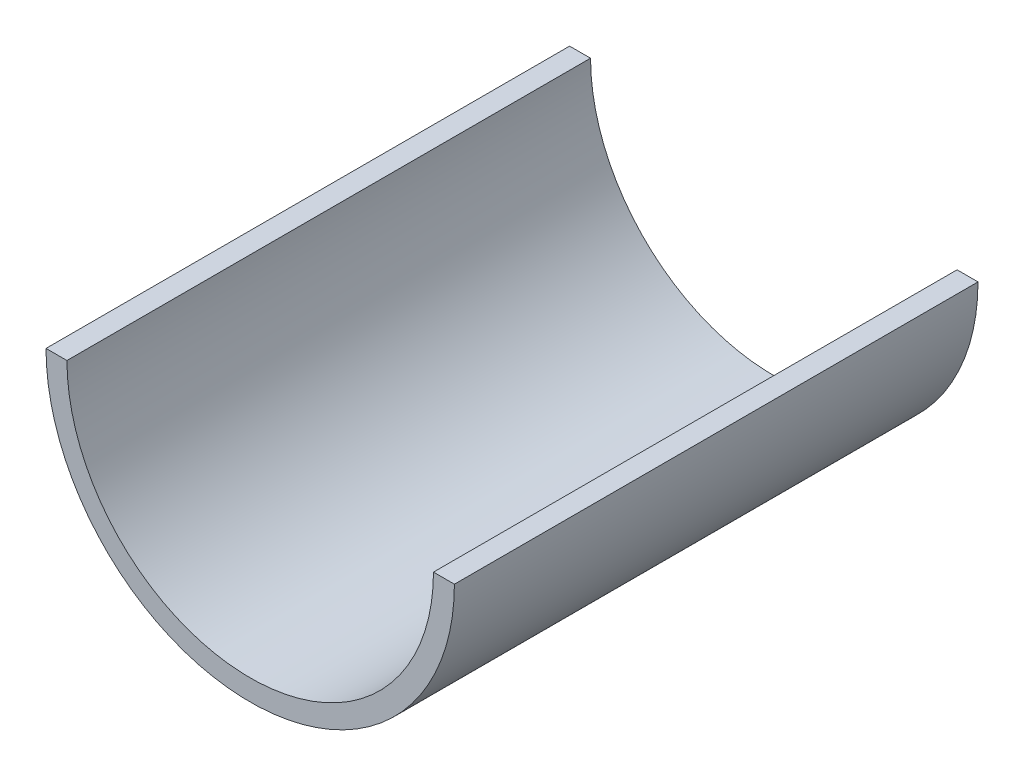
ISO-10303-21;
HEADER;
FILE_DESCRIPTION(('STEP AP214'),'2;1');
FILE_NAME('part.step','',(''),(''),'','','');
FILE_SCHEMA(('AUTOMOTIVE_DESIGN { 1 0 10303 214 1 1 1 1 }'));
ENDSEC;
DATA;
#1=APPLICATION_CONTEXT('core data for automotive mechanical design processes');
#2=APPLICATION_PROTOCOL_DEFINITION('international standard','automotive_design',2000,#1);
#3=PRODUCT_CONTEXT('',#1,'mechanical');
#4=PRODUCT('Part','Part','',(#3));
#5=PRODUCT_RELATED_PRODUCT_CATEGORY('part','',(#4));
#6=PRODUCT_DEFINITION_FORMATION('','',#4);
#7=PRODUCT_DEFINITION_CONTEXT('part definition',#1,'design');
#8=PRODUCT_DEFINITION('design','',#6,#7);
#9=PRODUCT_DEFINITION_SHAPE('','',#8);
#10=(LENGTH_UNIT() NAMED_UNIT(*) SI_UNIT(.MILLI.,.METRE.));
#11=(NAMED_UNIT(*) PLANE_ANGLE_UNIT() SI_UNIT($,.RADIAN.));
#12=(NAMED_UNIT(*) SI_UNIT($,.STERADIAN.) SOLID_ANGLE_UNIT());
#13=UNCERTAINTY_MEASURE_WITH_UNIT(LENGTH_MEASURE(1.E-05),#10,'distance_accuracy_value','');
#14=(GEOMETRIC_REPRESENTATION_CONTEXT(3) GLOBAL_UNCERTAINTY_ASSIGNED_CONTEXT((#13)) GLOBAL_UNIT_ASSIGNED_CONTEXT((#10,
#11,#12)) REPRESENTATION_CONTEXT('',''));
#15=CARTESIAN_POINT('',(0.,0.,0.));
#16=DIRECTION('',(0.,0.,1.));
#17=DIRECTION('',(1.,0.,0.));
#18=AXIS2_PLACEMENT_3D('',#15,#16,#17);
#19=CARTESIAN_POINT('',(0.,0.,100.));
#20=DIRECTION('',(0.,0.,-1.));
#21=DIRECTION('',(-1.,0.,0.));
#22=AXIS2_PLACEMENT_3D('',#19,#20,#21);
#23=CYLINDRICAL_SURFACE('',#22,39.);
#24=CARTESIAN_POINT('',(0.,0.,0.));
#25=DIRECTION('',(0.,0.,1.));
#26=DIRECTION('',(1.,0.,0.));
#27=AXIS2_PLACEMENT_3D('',#24,#25,#26);
#28=CIRCLE('',#27,39.);
#29=CARTESIAN_POINT('',(-39.,0.,0.));
#30=VERTEX_POINT('',#29);
#31=CARTESIAN_POINT('',(39.,0.,0.));
#32=VERTEX_POINT('',#31);
#33=EDGE_CURVE('E109',#30,#32,#28,.T.);
#34=ORIENTED_EDGE('',*,*,#33,.T.);
#35=DIRECTION('',(0.,0.,-1.));
#36=VECTOR('',#35,1.);
#37=CARTESIAN_POINT('',(39.,0.,100.));
#38=LINE('',#37,#36);
#39=CARTESIAN_POINT('',(39.,0.,100.));
#40=VERTEX_POINT('',#39);
#41=EDGE_CURVE('E11',#40,#32,#38,.T.);
#42=ORIENTED_EDGE('',*,*,#41,.F.);
#43=CARTESIAN_POINT('',(0.,0.,100.));
#44=DIRECTION('',(0.,0.,1.));
#45=DIRECTION('',(1.,0.,0.));
#46=AXIS2_PLACEMENT_3D('',#43,#44,#45);
#47=CIRCLE('',#46,39.);
#48=CARTESIAN_POINT('',(-39.,0.,100.));
#49=VERTEX_POINT('',#48);
#50=EDGE_CURVE('E82',#49,#40,#47,.T.);
#51=ORIENTED_EDGE('',*,*,#50,.F.);
#52=DIRECTION('',(0.,0.,-1.));
#53=VECTOR('',#52,1.);
#54=CARTESIAN_POINT('',(-39.,0.,100.));
#55=LINE('',#54,#53);
#56=EDGE_CURVE('E58',#49,#30,#55,.T.);
#57=ORIENTED_EDGE('',*,*,#56,.T.);
#58=EDGE_LOOP('',(#34,#42,#51,#57));
#59=FACE_BOUND('',#58,.T.);
#60=ADVANCED_FACE('F41',(#59),#23,.T.);
#61=CARTESIAN_POINT('',(35.,0.,100.));
#62=DIRECTION('',(0.,1.,0.));
#63=DIRECTION('',(0.,0.,1.));
#64=AXIS2_PLACEMENT_3D('',#61,#62,#63);
#65=PLANE('',#64);
#66=DIRECTION('',(1.,0.,0.));
#67=VECTOR('',#66,1.);
#68=CARTESIAN_POINT('',(35.,0.,0.));
#69=LINE('',#68,#67);
#70=CARTESIAN_POINT('',(35.,0.,0.));
#71=VERTEX_POINT('',#70);
#72=EDGE_CURVE('E91',#71,#32,#69,.T.);
#73=ORIENTED_EDGE('',*,*,#72,.F.);
#74=DIRECTION('',(0.,0.,-1.));
#75=VECTOR('',#74,1.);
#76=CARTESIAN_POINT('',(35.,0.,100.));
#77=LINE('',#76,#75);
#78=CARTESIAN_POINT('',(35.,0.,100.));
#79=VERTEX_POINT('',#78);
#80=EDGE_CURVE('E50',#79,#71,#77,.T.);
#81=ORIENTED_EDGE('',*,*,#80,.F.);
#82=DIRECTION('',(1.,0.,0.));
#83=VECTOR('',#82,1.);
#84=CARTESIAN_POINT('',(35.,0.,100.));
#85=LINE('',#84,#83);
#86=EDGE_CURVE('E89',#79,#40,#85,.T.);
#87=ORIENTED_EDGE('',*,*,#86,.T.);
#88=ORIENTED_EDGE('',*,*,#41,.T.);
#89=EDGE_LOOP('',(#73,#81,#87,#88));
#90=FACE_BOUND('',#89,.T.);
#91=ADVANCED_FACE('F88',(#90),#65,.T.);
#92=CARTESIAN_POINT('',(0.,0.,100.));
#93=DIRECTION('',(0.,0.,-1.));
#94=DIRECTION('',(-1.,0.,0.));
#95=AXIS2_PLACEMENT_3D('',#92,#93,#94);
#96=CYLINDRICAL_SURFACE('',#95,35.);
#97=CARTESIAN_POINT('',(0.,0.,0.));
#98=DIRECTION('',(0.,0.,1.));
#99=DIRECTION('',(1.,0.,0.));
#100=AXIS2_PLACEMENT_3D('',#97,#98,#99);
#101=CIRCLE('',#100,35.);
#102=CARTESIAN_POINT('',(-35.,0.,0.));
#103=VERTEX_POINT('',#102);
#104=EDGE_CURVE('E114',#103,#71,#101,.T.);
#105=ORIENTED_EDGE('',*,*,#104,.F.);
#106=DIRECTION('',(0.,0.,-1.));
#107=VECTOR('',#106,1.);
#108=CARTESIAN_POINT('',(-35.,0.,100.));
#109=LINE('',#108,#107);
#110=CARTESIAN_POINT('',(-35.,0.,100.));
#111=VERTEX_POINT('',#110);
#112=EDGE_CURVE('E71',#111,#103,#109,.T.);
#113=ORIENTED_EDGE('',*,*,#112,.F.);
#114=CARTESIAN_POINT('',(0.,0.,100.));
#115=DIRECTION('',(0.,0.,1.));
#116=DIRECTION('',(1.,0.,0.));
#117=AXIS2_PLACEMENT_3D('',#114,#115,#116);
#118=CIRCLE('',#117,35.);
#119=EDGE_CURVE('E98',#111,#79,#118,.T.);
#120=ORIENTED_EDGE('',*,*,#119,.T.);
#121=ORIENTED_EDGE('',*,*,#80,.T.);
#122=EDGE_LOOP('',(#105,#113,#120,#121));
#123=FACE_BOUND('',#122,.T.);
#124=ADVANCED_FACE('F101',(#123),#96,.F.);
#125=CARTESIAN_POINT('',(-39.,0.,100.));
#126=DIRECTION('',(0.,1.,0.));
#127=DIRECTION('',(-1.,0.,0.));
#128=AXIS2_PLACEMENT_3D('',#125,#126,#127);
#129=PLANE('',#128);
#130=DIRECTION('',(1.,0.,0.));
#131=VECTOR('',#130,1.);
#132=CARTESIAN_POINT('',(-39.,0.,0.));
#133=LINE('',#132,#131);
#134=EDGE_CURVE('E117',#30,#103,#133,.T.);
#135=ORIENTED_EDGE('',*,*,#134,.F.);
#136=ORIENTED_EDGE('',*,*,#56,.F.);
#137=DIRECTION('',(1.,0.,0.));
#138=VECTOR('',#137,1.);
#139=CARTESIAN_POINT('',(-39.,0.,100.));
#140=LINE('',#139,#138);
#141=EDGE_CURVE('E103',#49,#111,#140,.T.);
#142=ORIENTED_EDGE('',*,*,#141,.T.);
#143=ORIENTED_EDGE('',*,*,#112,.T.);
#144=EDGE_LOOP('',(#135,#136,#142,#143));
#145=FACE_BOUND('',#144,.T.);
#146=ADVANCED_FACE('F127',(#145),#129,.T.);
#147=CARTESIAN_POINT('',(0.,0.,100.));
#148=DIRECTION('',(0.,0.,1.));
#149=DIRECTION('',(1.,0.,0.));
#150=AXIS2_PLACEMENT_3D('',#147,#148,#149);
#151=PLANE('',#150);
#152=ORIENTED_EDGE('',*,*,#50,.T.);
#153=ORIENTED_EDGE('',*,*,#86,.F.);
#154=ORIENTED_EDGE('',*,*,#119,.F.);
#155=ORIENTED_EDGE('',*,*,#141,.F.);
#156=EDGE_LOOP('',(#152,#153,#154,#155));
#157=FACE_BOUND('',#156,.T.);
#158=ADVANCED_FACE('F97',(#157),#151,.T.);
#159=CARTESIAN_POINT('',(0.,0.,0.));
#160=DIRECTION('',(0.,0.,1.));
#161=DIRECTION('',(1.,0.,0.));
#162=AXIS2_PLACEMENT_3D('',#159,#160,#161);
#163=PLANE('',#162);
#164=ORIENTED_EDGE('',*,*,#33,.F.);
#165=ORIENTED_EDGE('',*,*,#134,.T.);
#166=ORIENTED_EDGE('',*,*,#104,.T.);
#167=ORIENTED_EDGE('',*,*,#72,.T.);
#168=EDGE_LOOP('',(#164,#165,#166,#167));
#169=FACE_BOUND('',#168,.T.);
#170=ADVANCED_FACE('F126',(#169),#163,.F.);
#171=CLOSED_SHELL('',(#60,#91,#124,#146,#158,#170));
#172=MANIFOLD_SOLID_BREP('B2',#171);
#173=ADVANCED_BREP_SHAPE_REPRESENTATION('',(#18,#172),#14);
#174=SHAPE_DEFINITION_REPRESENTATION(#9,#173);
ENDSEC;
END-ISO-10303-21;
